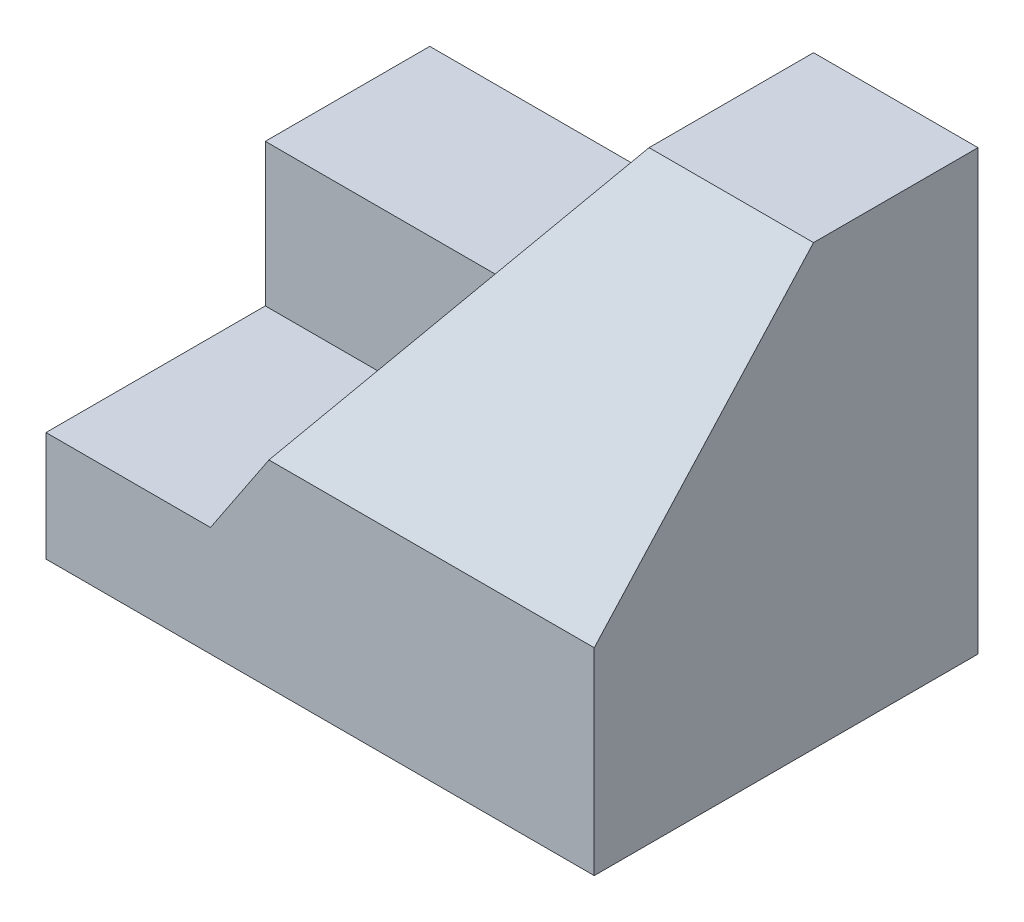
ISO-10303-21;
HEADER;
FILE_DESCRIPTION(('STEP AP214'),'2;1');
FILE_NAME('part.step','',(''),(''),'','','');
FILE_SCHEMA(('AUTOMOTIVE_DESIGN { 1 0 10303 214 1 1 1 1 }'));
ENDSEC;
DATA;
#1=APPLICATION_CONTEXT('core data for automotive mechanical design processes');
#2=APPLICATION_PROTOCOL_DEFINITION('international standard','automotive_design',2000,#1);
#3=PRODUCT_CONTEXT('',#1,'mechanical');
#4=PRODUCT('Part','Part','',(#3));
#5=PRODUCT_RELATED_PRODUCT_CATEGORY('part','',(#4));
#6=PRODUCT_DEFINITION_FORMATION('','',#4);
#7=PRODUCT_DEFINITION_CONTEXT('part definition',#1,'design');
#8=PRODUCT_DEFINITION('design','',#6,#7);
#9=PRODUCT_DEFINITION_SHAPE('','',#8);
#10=(LENGTH_UNIT() NAMED_UNIT(*) SI_UNIT(.MILLI.,.METRE.));
#11=(NAMED_UNIT(*) PLANE_ANGLE_UNIT() SI_UNIT($,.RADIAN.));
#12=(NAMED_UNIT(*) SI_UNIT($,.STERADIAN.) SOLID_ANGLE_UNIT());
#13=UNCERTAINTY_MEASURE_WITH_UNIT(LENGTH_MEASURE(1.E-05),#10,'distance_accuracy_value','');
#14=(GEOMETRIC_REPRESENTATION_CONTEXT(3) GLOBAL_UNCERTAINTY_ASSIGNED_CONTEXT((#13)) GLOBAL_UNIT_ASSIGNED_CONTEXT((#10,
#11,#12)) REPRESENTATION_CONTEXT('',''));
#15=CARTESIAN_POINT('',(0.,0.,0.));
#16=DIRECTION('',(0.,0.,1.));
#17=DIRECTION('',(1.,0.,0.));
#18=AXIS2_PLACEMENT_3D('',#15,#16,#17);
#19=CARTESIAN_POINT('',(0.,20.,0.));
#20=DIRECTION('',(0.,-1.,0.));
#21=DIRECTION('',(0.,0.,-1.));
#22=AXIS2_PLACEMENT_3D('',#19,#20,#21);
#23=PLANE('',#22);
#24=CARTESIAN_POINT('',(30.,20.,30.));
#25=DIRECTION('',(0.,0.,1.));
#26=VECTOR('',#25,1.);
#27=LINE('',#24,#26);
#28=CARTESIAN_POINT('',(30.,20.,30.));
#29=VERTEX_POINT('',#28);
#30=CARTESIAN_POINT('',(30.,20.,70.));
#31=VERTEX_POINT('',#30);
#32=EDGE_CURVE('E250',#29,#31,#27,.T.);
#33=ORIENTED_EDGE('',*,*,#32,.F.);
#34=DIRECTION('',(-1.,0.,0.));
#35=VECTOR('',#34,1.);
#36=CARTESIAN_POINT('',(46.,20.,30.));
#37=LINE('',#36,#35);
#38=CARTESIAN_POINT('',(0.,20.,30.));
#39=VERTEX_POINT('',#38);
#40=EDGE_CURVE('E233',#29,#39,#37,.T.);
#41=ORIENTED_EDGE('',*,*,#40,.T.);
#42=DIRECTION('',(0.,0.,-1.));
#43=VECTOR('',#42,1.);
#44=CARTESIAN_POINT('',(0.,20.,70.));
#45=LINE('',#44,#43);
#46=CARTESIAN_POINT('',(0.,20.,70.));
#47=VERTEX_POINT('',#46);
#48=EDGE_CURVE('E248',#47,#39,#45,.T.);
#49=ORIENTED_EDGE('',*,*,#48,.F.);
#50=DIRECTION('',(-1.,0.,0.));
#51=VECTOR('',#50,1.);
#52=CARTESIAN_POINT('',(100.,20.,70.));
#53=LINE('',#52,#51);
#54=EDGE_CURVE('E260',#31,#47,#53,.T.);
#55=ORIENTED_EDGE('',*,*,#54,.F.);
#56=EDGE_LOOP('',(#33,#41,#49,#55));
#57=FACE_BOUND('',#56,.T.);
#58=ADVANCED_FACE('F139',(#57),#23,.F.);
#59=CARTESIAN_POINT('',(0.,0.,0.));
#60=DIRECTION('',(0.,-1.,0.));
#61=DIRECTION('',(0.,0.,-1.));
#62=AXIS2_PLACEMENT_3D('',#59,#60,#61);
#63=PLANE('',#62);
#64=DIRECTION('',(0.,0.,-1.));
#65=VECTOR('',#64,1.);
#66=CARTESIAN_POINT('',(0.,0.,70.));
#67=LINE('',#66,#65);
#68=CARTESIAN_POINT('',(0.,0.,70.));
#69=VERTEX_POINT('',#68);
#70=CARTESIAN_POINT('',(0.,0.,0.));
#71=VERTEX_POINT('',#70);
#72=EDGE_CURVE('E604',#69,#71,#67,.T.);
#73=ORIENTED_EDGE('',*,*,#72,.T.);
#74=DIRECTION('',(1.,0.,0.));
#75=VECTOR('',#74,1.);
#76=CARTESIAN_POINT('',(0.,0.,0.));
#77=LINE('',#76,#75);
#78=CARTESIAN_POINT('',(100.,0.,0.));
#79=VERTEX_POINT('',#78);
#80=EDGE_CURVE('E329',#71,#79,#77,.T.);
#81=ORIENTED_EDGE('',*,*,#80,.T.);
#82=DIRECTION('',(0.,0.,1.));
#83=VECTOR('',#82,1.);
#84=CARTESIAN_POINT('',(100.,0.,0.));
#85=LINE('',#84,#83);
#86=CARTESIAN_POINT('',(100.,0.,70.));
#87=VERTEX_POINT('',#86);
#88=EDGE_CURVE('E609',#79,#87,#85,.T.);
#89=ORIENTED_EDGE('',*,*,#88,.T.);
#90=DIRECTION('',(-1.,0.,0.));
#91=VECTOR('',#90,1.);
#92=CARTESIAN_POINT('',(100.,0.,70.));
#93=LINE('',#92,#91);
#94=EDGE_CURVE('E605',#87,#69,#93,.T.);
#95=ORIENTED_EDGE('',*,*,#94,.T.);
#96=EDGE_LOOP('',(#73,#81,#89,#95));
#97=FACE_BOUND('',#96,.T.);
#98=ADVANCED_FACE('F284',(#97),#63,.T.);
#99=CARTESIAN_POINT('',(0.,0.,0.));
#100=DIRECTION('',(-1.,0.,0.));
#101=DIRECTION('',(0.,0.,1.));
#102=AXIS2_PLACEMENT_3D('',#99,#100,#101);
#103=PLANE('',#102);
#104=CARTESIAN_POINT('',(0.,0.,70.));
#105=DIRECTION('',(0.,1.,0.));
#106=VECTOR('',#105,1.);
#107=LINE('',#104,#106);
#108=EDGE_CURVE('E258',#69,#47,#107,.T.);
#109=ORIENTED_EDGE('',*,*,#108,.T.);
#110=ORIENTED_EDGE('',*,*,#48,.T.);
#111=CARTESIAN_POINT('',(0.,20.,30.));
#112=DIRECTION('',(0.,1.,0.));
#113=VECTOR('',#112,1.);
#114=LINE('',#111,#113);
#115=CARTESIAN_POINT('',(0.,46.,30.));
#116=VERTEX_POINT('',#115);
#117=EDGE_CURVE('E229',#39,#116,#114,.T.);
#118=ORIENTED_EDGE('',*,*,#117,.T.);
#119=DIRECTION('',(0.,0.,-1.));
#120=VECTOR('',#119,1.);
#121=CARTESIAN_POINT('',(0.,46.,30.));
#122=LINE('',#121,#120);
#123=CARTESIAN_POINT('',(0.,46.,0.));
#124=VERTEX_POINT('',#123);
#125=EDGE_CURVE('E322',#116,#124,#122,.T.);
#126=ORIENTED_EDGE('',*,*,#125,.T.);
#127=CARTESIAN_POINT('',(0.,20.,0.));
#128=DIRECTION('',(0.,1.,0.));
#129=VECTOR('',#128,1.);
#130=LINE('',#127,#129);
#131=CARTESIAN_POINT('',(0.,20.,0.));
#132=VERTEX_POINT('',#131);
#133=EDGE_CURVE('E242',#132,#124,#130,.T.);
#134=ORIENTED_EDGE('',*,*,#133,.F.);
#135=CARTESIAN_POINT('',(0.,0.,0.));
#136=DIRECTION('',(0.,1.,0.));
#137=VECTOR('',#136,1.);
#138=LINE('',#135,#137);
#139=EDGE_CURVE('E320',#71,#132,#138,.T.);
#140=ORIENTED_EDGE('',*,*,#139,.F.);
#141=ORIENTED_EDGE('',*,*,#72,.F.);
#142=EDGE_LOOP('',(#109,#110,#118,#126,#134,#140,#141));
#143=FACE_BOUND('',#142,.T.);
#144=ADVANCED_FACE('F255',(#143),#103,.T.);
#145=CARTESIAN_POINT('',(0.,0.,0.));
#146=DIRECTION('',(0.,0.,-1.));
#147=DIRECTION('',(-1.,0.,0.));
#148=AXIS2_PLACEMENT_3D('',#145,#146,#147);
#149=PLANE('',#148);
#150=ORIENTED_EDGE('',*,*,#139,.T.);
#151=ORIENTED_EDGE('',*,*,#133,.T.);
#152=DIRECTION('',(1.,0.,0.));
#153=VECTOR('',#152,1.);
#154=CARTESIAN_POINT('',(0.,46.,0.));
#155=LINE('',#154,#153);
#156=CARTESIAN_POINT('',(46.,46.,0.));
#157=VERTEX_POINT('',#156);
#158=EDGE_CURVE('E491',#124,#157,#155,.T.);
#159=ORIENTED_EDGE('',*,*,#158,.T.);
#160=CARTESIAN_POINT('',(46.,44.,0.));
#161=DIRECTION('',(0.,1.,0.));
#162=VECTOR('',#161,1.);
#163=LINE('',#160,#162);
#164=CARTESIAN_POINT('',(46.,44.,0.));
#165=VERTEX_POINT('',#164);
#166=EDGE_CURVE('E502',#165,#157,#163,.T.);
#167=ORIENTED_EDGE('',*,*,#166,.F.);
#168=DIRECTION('',(-0.554700196225229,-0.832050294337843,0.));
#169=VECTOR('',#168,1.);
#170=CARTESIAN_POINT('',(70.,80.,0.));
#171=LINE('',#170,#169);
#172=CARTESIAN_POINT('',(70.,80.,0.));
#173=VERTEX_POINT('',#172);
#174=EDGE_CURVE('E511',#173,#165,#171,.T.);
#175=ORIENTED_EDGE('',*,*,#174,.F.);
#176=DIRECTION('',(-1.,0.,0.));
#177=VECTOR('',#176,1.);
#178=CARTESIAN_POINT('',(100.,80.,0.));
#179=LINE('',#178,#177);
#180=CARTESIAN_POINT('',(100.,80.,0.));
#181=VERTEX_POINT('',#180);
#182=EDGE_CURVE('E530',#181,#173,#179,.T.);
#183=ORIENTED_EDGE('',*,*,#182,.F.);
#184=DIRECTION('',(0.,1.,0.));
#185=VECTOR('',#184,1.);
#186=CARTESIAN_POINT('',(100.,20.,0.));
#187=LINE('',#186,#185);
#188=CARTESIAN_POINT('',(100.,20.,0.));
#189=VERTEX_POINT('',#188);
#190=EDGE_CURVE('E466',#189,#181,#187,.T.);
#191=ORIENTED_EDGE('',*,*,#190,.F.);
#192=CARTESIAN_POINT('',(100.,0.,0.));
#193=DIRECTION('',(0.,1.,0.));
#194=VECTOR('',#193,1.);
#195=LINE('',#192,#194);
#196=EDGE_CURVE('E261',#79,#189,#195,.T.);
#197=ORIENTED_EDGE('',*,*,#196,.F.);
#198=ORIENTED_EDGE('',*,*,#80,.F.);
#199=EDGE_LOOP('',(#150,#151,#159,#167,#175,#183,#191,#197,#198));
#200=FACE_BOUND('',#199,.T.);
#201=ADVANCED_FACE('F283',(#200),#149,.T.);
#202=CARTESIAN_POINT('',(0.,0.,70.));
#203=DIRECTION('',(0.,0.,1.));
#204=DIRECTION('',(1.,0.,0.));
#205=AXIS2_PLACEMENT_3D('',#202,#203,#204);
#206=PLANE('',#205);
#207=DIRECTION('',(1.,0.,0.));
#208=VECTOR('',#207,1.);
#209=CARTESIAN_POINT('',(0.,36.,70.));
#210=LINE('',#209,#208);
#211=CARTESIAN_POINT('',(40.6666666666666,36.,70.));
#212=VERTEX_POINT('',#211);
#213=CARTESIAN_POINT('',(100.,36.,70.));
#214=VERTEX_POINT('',#213);
#215=EDGE_CURVE('E836',#212,#214,#210,.T.);
#216=ORIENTED_EDGE('',*,*,#215,.F.);
#217=DIRECTION('',(-0.554700196225229,-0.832050294337843,0.));
#218=VECTOR('',#217,1.);
#219=CARTESIAN_POINT('',(70.,80.,70.));
#220=LINE('',#219,#218);
#221=EDGE_CURVE('E396',#212,#31,#220,.T.);
#222=ORIENTED_EDGE('',*,*,#221,.T.);
#223=ORIENTED_EDGE('',*,*,#54,.T.);
#224=ORIENTED_EDGE('',*,*,#108,.F.);
#225=ORIENTED_EDGE('',*,*,#94,.F.);
#226=CARTESIAN_POINT('',(100.,0.,70.));
#227=DIRECTION('',(0.,1.,0.));
#228=VECTOR('',#227,1.);
#229=LINE('',#226,#228);
#230=CARTESIAN_POINT('',(100.,20.,70.));
#231=VERTEX_POINT('',#230);
#232=EDGE_CURVE('E331',#87,#231,#229,.T.);
#233=ORIENTED_EDGE('',*,*,#232,.T.);
#234=DIRECTION('',(0.,1.,0.));
#235=VECTOR('',#234,1.);
#236=CARTESIAN_POINT('',(100.,20.,70.));
#237=LINE('',#236,#235);
#238=EDGE_CURVE('E447',#231,#214,#237,.T.);
#239=ORIENTED_EDGE('',*,*,#238,.T.);
#240=EDGE_LOOP('',(#216,#222,#223,#224,#225,#233,#239));
#241=FACE_BOUND('',#240,.T.);
#242=ADVANCED_FACE('F352',(#241),#206,.T.);
#243=CARTESIAN_POINT('',(100.,0.,0.));
#244=DIRECTION('',(1.,0.,0.));
#245=DIRECTION('',(0.,0.,-1.));
#246=AXIS2_PLACEMENT_3D('',#243,#244,#245);
#247=PLANE('',#246);
#248=DIRECTION('',(0.,0.739940073395944,-0.672672793996313));
#249=VECTOR('',#248,1.);
#250=CARTESIAN_POINT('',(100.,51.131221719457,56.2443438914027));
#251=LINE('',#250,#249);
#252=CARTESIAN_POINT('',(100.,80.,30.));
#253=VERTEX_POINT('',#252);
#254=EDGE_CURVE('E167',#214,#253,#251,.T.);
#255=ORIENTED_EDGE('',*,*,#254,.F.);
#256=ORIENTED_EDGE('',*,*,#238,.F.);
#257=ORIENTED_EDGE('',*,*,#232,.F.);
#258=ORIENTED_EDGE('',*,*,#88,.F.);
#259=ORIENTED_EDGE('',*,*,#196,.T.);
#260=ORIENTED_EDGE('',*,*,#190,.T.);
#261=CARTESIAN_POINT('',(100.,80.,0.));
#262=DIRECTION('',(0.,0.,1.));
#263=VECTOR('',#262,1.);
#264=LINE('',#261,#263);
#265=EDGE_CURVE('E547',#181,#253,#264,.T.);
#266=ORIENTED_EDGE('',*,*,#265,.T.);
#267=EDGE_LOOP('',(#255,#256,#257,#258,#259,#260,#266));
#268=FACE_BOUND('',#267,.T.);
#269=ADVANCED_FACE('F360',(#268),#247,.T.);
#270=CARTESIAN_POINT('',(11.5384615384615,-7.69230769230769,0.));
#271=DIRECTION('',(0.832050294337844,-0.554700196225229,0.));
#272=DIRECTION('',(0.554700196225229,0.832050294337844,0.));
#273=AXIS2_PLACEMENT_3D('',#270,#271,#272);
#274=PLANE('',#273);
#275=DIRECTION('',(0.,0.,1.));
#276=VECTOR('',#275,1.);
#277=CARTESIAN_POINT('',(46.,44.,0.));
#278=LINE('',#277,#276);
#279=CARTESIAN_POINT('',(46.,44.,30.));
#280=VERTEX_POINT('',#279);
#281=EDGE_CURVE('E150',#165,#280,#278,.T.);
#282=ORIENTED_EDGE('',*,*,#281,.T.);
#283=DIRECTION('',(-0.554700196225229,-0.832050294337844,0.));
#284=VECTOR('',#283,1.);
#285=CARTESIAN_POINT('',(11.5384615384615,-7.69230769230769,30.));
#286=LINE('',#285,#284);
#287=EDGE_CURVE('E13',#280,#29,#286,.T.);
#288=ORIENTED_EDGE('',*,*,#287,.T.);
#289=ORIENTED_EDGE('',*,*,#32,.T.);
#290=ORIENTED_EDGE('',*,*,#221,.F.);
#291=DIRECTION('',(0.442395420463307,0.663593130694961,-0.603266482449965));
#292=VECTOR('',#291,1.);
#293=CARTESIAN_POINT('',(40.8208653457339,36.2312980186009,69.7897290739992));
#294=LINE('',#293,#292);
#295=CARTESIAN_POINT('',(70.,80.,30.));
#296=VERTEX_POINT('',#295);
#297=EDGE_CURVE('E799',#212,#296,#294,.T.);
#298=ORIENTED_EDGE('',*,*,#297,.T.);
#299=CARTESIAN_POINT('',(70.,80.,0.));
#300=DIRECTION('',(0.,0.,1.));
#301=VECTOR('',#300,1.);
#302=LINE('',#299,#301);
#303=EDGE_CURVE('E516',#173,#296,#302,.T.);
#304=ORIENTED_EDGE('',*,*,#303,.F.);
#305=ORIENTED_EDGE('',*,*,#174,.T.);
#306=EDGE_LOOP('',(#282,#288,#289,#290,#298,#304,#305));
#307=FACE_BOUND('',#306,.T.);
#308=ADVANCED_FACE('F415',(#307),#274,.F.);
#309=CARTESIAN_POINT('',(0.,80.,0.));
#310=DIRECTION('',(0.,-1.,0.));
#311=DIRECTION('',(0.,0.,-1.));
#312=AXIS2_PLACEMENT_3D('',#309,#310,#311);
#313=PLANE('',#312);
#314=ORIENTED_EDGE('',*,*,#303,.T.);
#315=DIRECTION('',(1.,0.,0.));
#316=VECTOR('',#315,1.);
#317=CARTESIAN_POINT('',(0.,80.,30.));
#318=LINE('',#317,#316);
#319=EDGE_CURVE('E465',#296,#253,#318,.T.);
#320=ORIENTED_EDGE('',*,*,#319,.T.);
#321=ORIENTED_EDGE('',*,*,#265,.F.);
#322=ORIENTED_EDGE('',*,*,#182,.T.);
#323=EDGE_LOOP('',(#314,#320,#321,#322));
#324=FACE_BOUND('',#323,.T.);
#325=ADVANCED_FACE('F424',(#324),#313,.F.);
#326=CARTESIAN_POINT('',(-10.,36.,70.));
#327=DIRECTION('',(0.,-0.672672793996313,-0.739940073395944));
#328=DIRECTION('',(0.,0.739940073395944,-0.672672793996313));
#329=AXIS2_PLACEMENT_3D('',#326,#327,#328);
#330=PLANE('',#329);
#331=ORIENTED_EDGE('',*,*,#254,.T.);
#332=ORIENTED_EDGE('',*,*,#319,.F.);
#333=ORIENTED_EDGE('',*,*,#297,.F.);
#334=ORIENTED_EDGE('',*,*,#215,.T.);
#335=EDGE_LOOP('',(#331,#332,#333,#334));
#336=FACE_BOUND('',#335,.T.);
#337=ADVANCED_FACE('F425',(#336),#330,.F.);
#338=CARTESIAN_POINT('',(0.,0.,30.));
#339=DIRECTION('',(0.,0.,1.));
#340=DIRECTION('',(1.,0.,0.));
#341=AXIS2_PLACEMENT_3D('',#338,#339,#340);
#342=PLANE('',#341);
#343=ORIENTED_EDGE('',*,*,#287,.F.);
#344=CARTESIAN_POINT('',(46.,44.,30.));
#345=DIRECTION('',(0.,1.,0.));
#346=VECTOR('',#345,1.);
#347=LINE('',#344,#346);
#348=CARTESIAN_POINT('',(46.,46.,30.));
#349=VERTEX_POINT('',#348);
#350=EDGE_CURVE('E158',#280,#349,#347,.T.);
#351=ORIENTED_EDGE('',*,*,#350,.T.);
#352=DIRECTION('',(-1.,0.,0.));
#353=VECTOR('',#352,1.);
#354=CARTESIAN_POINT('',(46.,46.,30.));
#355=LINE('',#354,#353);
#356=EDGE_CURVE('E235',#349,#116,#355,.T.);
#357=ORIENTED_EDGE('',*,*,#356,.T.);
#358=ORIENTED_EDGE('',*,*,#117,.F.);
#359=ORIENTED_EDGE('',*,*,#40,.F.);
#360=EDGE_LOOP('',(#343,#351,#357,#358,#359));
#361=FACE_BOUND('',#360,.T.);
#362=ADVANCED_FACE('F232',(#361),#342,.T.);
#363=CARTESIAN_POINT('',(46.,0.,0.));
#364=DIRECTION('',(1.,0.,0.));
#365=DIRECTION('',(0.,0.,-1.));
#366=AXIS2_PLACEMENT_3D('',#363,#364,#365);
#367=PLANE('',#366);
#368=ORIENTED_EDGE('',*,*,#281,.F.);
#369=ORIENTED_EDGE('',*,*,#166,.T.);
#370=DIRECTION('',(0.,0.,1.));
#371=VECTOR('',#370,1.);
#372=CARTESIAN_POINT('',(46.,46.,0.));
#373=LINE('',#372,#371);
#374=EDGE_CURVE('E794',#157,#349,#373,.T.);
#375=ORIENTED_EDGE('',*,*,#374,.T.);
#376=ORIENTED_EDGE('',*,*,#350,.F.);
#377=EDGE_LOOP('',(#368,#369,#375,#376));
#378=FACE_BOUND('',#377,.T.);
#379=ADVANCED_FACE('F697',(#378),#367,.T.);
#380=CARTESIAN_POINT('',(0.,46.,0.));
#381=DIRECTION('',(0.,-1.,0.));
#382=DIRECTION('',(0.,0.,-1.));
#383=AXIS2_PLACEMENT_3D('',#380,#381,#382);
#384=PLANE('',#383);
#385=ORIENTED_EDGE('',*,*,#125,.F.);
#386=ORIENTED_EDGE('',*,*,#356,.F.);
#387=ORIENTED_EDGE('',*,*,#374,.F.);
#388=ORIENTED_EDGE('',*,*,#158,.F.);
#389=EDGE_LOOP('',(#385,#386,#387,#388));
#390=FACE_BOUND('',#389,.T.);
#391=ADVANCED_FACE('F705',(#390),#384,.F.);
#392=CLOSED_SHELL('',(#58,#98,#144,#201,#242,#269,#308,#325,#337,#362,#379,#391));
#393=MANIFOLD_SOLID_BREP('B2',#392);
#394=ADVANCED_BREP_SHAPE_REPRESENTATION('',(#18,#393),#14);
#395=SHAPE_DEFINITION_REPRESENTATION(#9,#394);
ENDSEC;
END-ISO-10303-21;
